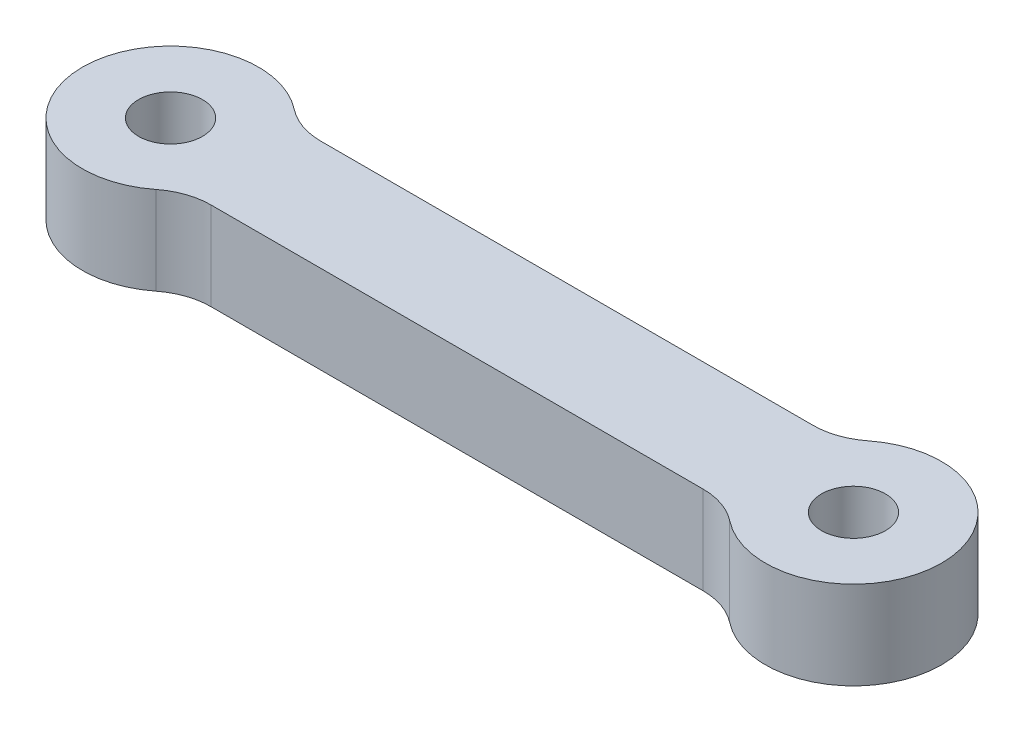
ISO-10303-21;
HEADER;
FILE_DESCRIPTION(('STEP AP214'),'2;1');
FILE_NAME('part.step','',(''),(''),'','','');
FILE_SCHEMA(('AUTOMOTIVE_DESIGN { 1 0 10303 214 1 1 1 1 }'));
ENDSEC;
DATA;
#1=APPLICATION_CONTEXT('core data for automotive mechanical design processes');
#2=APPLICATION_PROTOCOL_DEFINITION('international standard','automotive_design',2000,#1);
#3=PRODUCT_CONTEXT('',#1,'mechanical');
#4=PRODUCT('Part','Part','',(#3));
#5=PRODUCT_RELATED_PRODUCT_CATEGORY('part','',(#4));
#6=PRODUCT_DEFINITION_FORMATION('','',#4);
#7=PRODUCT_DEFINITION_CONTEXT('part definition',#1,'design');
#8=PRODUCT_DEFINITION('design','',#6,#7);
#9=PRODUCT_DEFINITION_SHAPE('','',#8);
#10=(LENGTH_UNIT() NAMED_UNIT(*) SI_UNIT(.MILLI.,.METRE.));
#11=(NAMED_UNIT(*) PLANE_ANGLE_UNIT() SI_UNIT($,.RADIAN.));
#12=(NAMED_UNIT(*) SI_UNIT($,.STERADIAN.) SOLID_ANGLE_UNIT());
#13=UNCERTAINTY_MEASURE_WITH_UNIT(LENGTH_MEASURE(1.E-05),#10,'distance_accuracy_value','');
#14=(GEOMETRIC_REPRESENTATION_CONTEXT(3) GLOBAL_UNCERTAINTY_ASSIGNED_CONTEXT((#13)) GLOBAL_UNIT_ASSIGNED_CONTEXT((#10,
#11,#12)) REPRESENTATION_CONTEXT('',''));
#15=CARTESIAN_POINT('',(0.,0.,0.));
#16=DIRECTION('',(0.,0.,1.));
#17=DIRECTION('',(1.,0.,0.));
#18=AXIS2_PLACEMENT_3D('',#15,#16,#17);
#19=CARTESIAN_POINT('',(31.,4.,0.));
#20=DIRECTION('',(0.,-1.,0.));
#21=DIRECTION('',(0.,0.,-1.));
#22=AXIS2_PLACEMENT_3D('',#19,#20,#21);
#23=CYLINDRICAL_SURFACE('',#22,4.00000000000001);
#24=CARTESIAN_POINT('',(31.,4.,0.));
#25=DIRECTION('',(0.,1.,0.));
#26=DIRECTION('',(0.,0.,1.));
#27=AXIS2_PLACEMENT_3D('',#24,#25,#26);
#28=CIRCLE('',#27,4.00000000000001);
#29=CARTESIAN_POINT('',(28.525641703473,4.,3.14285714285714));
#30=VERTEX_POINT('',#29);
#31=CARTESIAN_POINT('',(28.525641703473,4.,-3.14285714285714));
#32=VERTEX_POINT('',#31);
#33=EDGE_CURVE('E159',#30,#32,#28,.T.);
#34=ORIENTED_EDGE('',*,*,#33,.F.);
#35=DIRECTION('',(0.,-1.,0.));
#36=VECTOR('',#35,1.);
#37=CARTESIAN_POINT('',(28.525641703473,4.,3.14285714285714));
#38=LINE('',#37,#36);
#39=CARTESIAN_POINT('',(28.525641703473,0.,3.14285714285714));
#40=VERTEX_POINT('',#39);
#41=EDGE_CURVE('E171',#30,#40,#38,.T.);
#42=ORIENTED_EDGE('',*,*,#41,.T.);
#43=CARTESIAN_POINT('',(31.,0.,0.));
#44=DIRECTION('',(0.,1.,0.));
#45=DIRECTION('',(0.,0.,1.));
#46=AXIS2_PLACEMENT_3D('',#43,#44,#45);
#47=CIRCLE('',#46,4.00000000000001);
#48=CARTESIAN_POINT('',(28.525641703473,0.,-3.14285714285714));
#49=VERTEX_POINT('',#48);
#50=EDGE_CURVE('E198',#40,#49,#47,.T.);
#51=ORIENTED_EDGE('',*,*,#50,.T.);
#52=DIRECTION('',(0.,-1.,0.));
#53=VECTOR('',#52,1.);
#54=CARTESIAN_POINT('',(28.525641703473,4.,-3.14285714285714));
#55=LINE('',#54,#53);
#56=EDGE_CURVE('E168',#49,#32,#55,.F.);
#57=ORIENTED_EDGE('',*,*,#56,.T.);
#58=EDGE_LOOP('',(#34,#42,#51,#57));
#59=FACE_BOUND('',#58,.T.);
#60=ADVANCED_FACE('F46',(#59),#23,.T.);
#61=CARTESIAN_POINT('',(0.,4.,-2.5));
#62=DIRECTION('',(0.,0.,-1.));
#63=DIRECTION('',(-1.,0.,0.));
#64=AXIS2_PLACEMENT_3D('',#61,#62,#63);
#65=PLANE('',#64);
#66=DIRECTION('',(1.,0.,0.));
#67=VECTOR('',#66,1.);
#68=CARTESIAN_POINT('',(0.,4.,-2.5));
#69=LINE('',#68,#67);
#70=CARTESIAN_POINT('',(4.33012701892219,4.,-2.5));
#71=VERTEX_POINT('',#70);
#72=CARTESIAN_POINT('',(26.6698729810778,4.,-2.5));
#73=VERTEX_POINT('',#72);
#74=EDGE_CURVE('E205',#71,#73,#69,.T.);
#75=ORIENTED_EDGE('',*,*,#74,.T.);
#76=DIRECTION('',(0.,-1.,0.));
#77=VECTOR('',#76,1.);
#78=CARTESIAN_POINT('',(26.6698729810778,4.,-2.5));
#79=LINE('',#78,#77);
#80=CARTESIAN_POINT('',(26.6698729810778,0.,-2.5));
#81=VERTEX_POINT('',#80);
#82=EDGE_CURVE('E125',#73,#81,#79,.T.);
#83=ORIENTED_EDGE('',*,*,#82,.T.);
#84=DIRECTION('',(1.,0.,0.));
#85=VECTOR('',#84,1.);
#86=CARTESIAN_POINT('',(0.,0.,-2.5));
#87=LINE('',#86,#85);
#88=CARTESIAN_POINT('',(4.33012701892219,0.,-2.5));
#89=VERTEX_POINT('',#88);
#90=EDGE_CURVE('E152',#89,#81,#87,.T.);
#91=ORIENTED_EDGE('',*,*,#90,.F.);
#92=DIRECTION('',(0.,-1.,0.));
#93=VECTOR('',#92,1.);
#94=CARTESIAN_POINT('',(4.33012701892219,4.,-2.5));
#95=LINE('',#94,#93);
#96=EDGE_CURVE('E69',#89,#71,#95,.F.);
#97=ORIENTED_EDGE('',*,*,#96,.T.);
#98=EDGE_LOOP('',(#75,#83,#91,#97));
#99=FACE_BOUND('',#98,.T.);
#100=ADVANCED_FACE('F195',(#99),#65,.T.);
#101=CARTESIAN_POINT('',(0.,4.,0.));
#102=DIRECTION('',(0.,-1.,0.));
#103=DIRECTION('',(0.,0.,-1.));
#104=AXIS2_PLACEMENT_3D('',#101,#102,#103);
#105=CYLINDRICAL_SURFACE('',#104,4.);
#106=CARTESIAN_POINT('',(0.,0.,0.));
#107=DIRECTION('',(0.,1.,0.));
#108=DIRECTION('',(0.,0.,1.));
#109=AXIS2_PLACEMENT_3D('',#106,#107,#108);
#110=CIRCLE('',#109,4.);
#111=CARTESIAN_POINT('',(2.47435829652697,0.,-3.14285714285714));
#112=VERTEX_POINT('',#111);
#113=CARTESIAN_POINT('',(2.47435829652697,0.,3.14285714285714));
#114=VERTEX_POINT('',#113);
#115=EDGE_CURVE('E145',#112,#114,#110,.T.);
#116=ORIENTED_EDGE('',*,*,#115,.T.);
#117=DIRECTION('',(0.,-1.,0.));
#118=VECTOR('',#117,1.);
#119=CARTESIAN_POINT('',(2.47435829652697,4.,3.14285714285714));
#120=LINE('',#119,#118);
#121=CARTESIAN_POINT('',(2.47435829652697,4.,3.14285714285714));
#122=VERTEX_POINT('',#121);
#123=EDGE_CURVE('E118',#114,#122,#120,.F.);
#124=ORIENTED_EDGE('',*,*,#123,.T.);
#125=CARTESIAN_POINT('',(0.,4.,0.));
#126=DIRECTION('',(0.,1.,0.));
#127=DIRECTION('',(0.,0.,1.));
#128=AXIS2_PLACEMENT_3D('',#125,#126,#127);
#129=CIRCLE('',#128,4.);
#130=CARTESIAN_POINT('',(2.47435829652697,4.,-3.14285714285714));
#131=VERTEX_POINT('',#130);
#132=EDGE_CURVE('E204',#131,#122,#129,.T.);
#133=ORIENTED_EDGE('',*,*,#132,.F.);
#134=DIRECTION('',(0.,-1.,0.));
#135=VECTOR('',#134,1.);
#136=CARTESIAN_POINT('',(2.47435829652697,4.,-3.14285714285714));
#137=LINE('',#136,#135);
#138=EDGE_CURVE('E136',#131,#112,#137,.T.);
#139=ORIENTED_EDGE('',*,*,#138,.T.);
#140=EDGE_LOOP('',(#116,#124,#133,#139));
#141=FACE_BOUND('',#140,.T.);
#142=ADVANCED_FACE('F207',(#141),#105,.T.);
#143=CARTESIAN_POINT('',(0.,4.,0.));
#144=DIRECTION('',(0.,-1.,0.));
#145=DIRECTION('',(0.,0.,-1.));
#146=AXIS2_PLACEMENT_3D('',#143,#144,#145);
#147=CYLINDRICAL_SURFACE('',#146,1.45);
#148=CARTESIAN_POINT('',(0.,4.,0.));
#149=DIRECTION('',(0.,1.,0.));
#150=DIRECTION('',(0.,0.,1.));
#151=AXIS2_PLACEMENT_3D('',#148,#149,#150);
#152=CIRCLE('',#151,1.45);
#153=CARTESIAN_POINT('',(0.,4.,1.45));
#154=VERTEX_POINT('',#153);
#155=EDGE_CURVE('E212',#154,#154,#152,.T.);
#156=ORIENTED_EDGE('',*,*,#155,.T.);
#157=EDGE_LOOP('',(#156));
#158=FACE_BOUND('',#157,.T.);
#159=CARTESIAN_POINT('',(0.,0.,0.));
#160=DIRECTION('',(0.,1.,0.));
#161=DIRECTION('',(0.,0.,1.));
#162=AXIS2_PLACEMENT_3D('',#159,#160,#161);
#163=CIRCLE('',#162,1.45);
#164=CARTESIAN_POINT('',(0.,0.,1.45));
#165=VERTEX_POINT('',#164);
#166=EDGE_CURVE('E144',#165,#165,#163,.T.);
#167=ORIENTED_EDGE('',*,*,#166,.F.);
#168=EDGE_LOOP('',(#167));
#169=FACE_BOUND('',#168,.T.);
#170=ADVANCED_FACE('F261',(#158,#169),#147,.F.);
#171=CARTESIAN_POINT('',(0.,4.,2.5));
#172=DIRECTION('',(0.,0.,-1.));
#173=DIRECTION('',(-1.,0.,0.));
#174=AXIS2_PLACEMENT_3D('',#171,#172,#173);
#175=PLANE('',#174);
#176=DIRECTION('',(1.,0.,0.));
#177=VECTOR('',#176,1.);
#178=CARTESIAN_POINT('',(0.,4.,2.5));
#179=LINE('',#178,#177);
#180=CARTESIAN_POINT('',(4.3301270189222,4.,2.5));
#181=VERTEX_POINT('',#180);
#182=CARTESIAN_POINT('',(26.6698729810778,4.,2.5));
#183=VERTEX_POINT('',#182);
#184=EDGE_CURVE('E134',#181,#183,#179,.T.);
#185=ORIENTED_EDGE('',*,*,#184,.F.);
#186=DIRECTION('',(0.,1.,0.));
#187=VECTOR('',#186,1.);
#188=CARTESIAN_POINT('',(4.3301270189222,0.,2.5));
#189=LINE('',#188,#187);
#190=CARTESIAN_POINT('',(4.3301270189222,0.,2.5));
#191=VERTEX_POINT('',#190);
#192=EDGE_CURVE('E117',#181,#191,#189,.F.);
#193=ORIENTED_EDGE('',*,*,#192,.T.);
#194=DIRECTION('',(1.,0.,0.));
#195=VECTOR('',#194,1.);
#196=CARTESIAN_POINT('',(0.,0.,2.5));
#197=LINE('',#196,#195);
#198=CARTESIAN_POINT('',(26.6698729810778,0.,2.5));
#199=VERTEX_POINT('',#198);
#200=EDGE_CURVE('E131',#191,#199,#197,.T.);
#201=ORIENTED_EDGE('',*,*,#200,.T.);
#202=DIRECTION('',(0.,1.,0.));
#203=VECTOR('',#202,1.);
#204=CARTESIAN_POINT('',(26.6698729810778,4.,2.5));
#205=LINE('',#204,#203);
#206=EDGE_CURVE('E137',#199,#183,#205,.T.);
#207=ORIENTED_EDGE('',*,*,#206,.T.);
#208=EDGE_LOOP('',(#185,#193,#201,#207));
#209=FACE_BOUND('',#208,.T.);
#210=ADVANCED_FACE('F130',(#209),#175,.F.);
#211=CARTESIAN_POINT('',(31.,4.,0.));
#212=DIRECTION('',(0.,-1.,0.));
#213=DIRECTION('',(0.,0.,-1.));
#214=AXIS2_PLACEMENT_3D('',#211,#212,#213);
#215=CYLINDRICAL_SURFACE('',#214,1.45);
#216=CARTESIAN_POINT('',(31.,4.,0.));
#217=DIRECTION('',(0.,1.,0.));
#218=DIRECTION('',(0.,0.,1.));
#219=AXIS2_PLACEMENT_3D('',#216,#217,#218);
#220=CIRCLE('',#219,1.45);
#221=CARTESIAN_POINT('',(31.,4.,1.45));
#222=VERTEX_POINT('',#221);
#223=EDGE_CURVE('E161',#222,#222,#220,.T.);
#224=ORIENTED_EDGE('',*,*,#223,.T.);
#225=EDGE_LOOP('',(#224));
#226=FACE_BOUND('',#225,.T.);
#227=CARTESIAN_POINT('',(31.,0.,0.));
#228=DIRECTION('',(0.,1.,0.));
#229=DIRECTION('',(0.,0.,1.));
#230=AXIS2_PLACEMENT_3D('',#227,#228,#229);
#231=CIRCLE('',#230,1.45);
#232=CARTESIAN_POINT('',(31.,0.,1.45));
#233=VERTEX_POINT('',#232);
#234=EDGE_CURVE('E150',#233,#233,#231,.T.);
#235=ORIENTED_EDGE('',*,*,#234,.F.);
#236=EDGE_LOOP('',(#235));
#237=FACE_BOUND('',#236,.T.);
#238=ADVANCED_FACE('F255',(#226,#237),#215,.F.);
#239=CARTESIAN_POINT('',(0.,4.,0.));
#240=DIRECTION('',(0.,1.,0.));
#241=DIRECTION('',(0.,0.,1.));
#242=AXIS2_PLACEMENT_3D('',#239,#240,#241);
#243=PLANE('',#242);
#244=ORIENTED_EDGE('',*,*,#184,.T.);
#245=CARTESIAN_POINT('',(26.6698729810778,4.,5.5));
#246=DIRECTION('',(0.,1.,0.));
#247=DIRECTION('',(0.,0.,1.));
#248=AXIS2_PLACEMENT_3D('',#245,#246,#247);
#249=CIRCLE('',#248,3.);
#250=EDGE_CURVE('E184',#183,#30,#249,.F.);
#251=ORIENTED_EDGE('',*,*,#250,.T.);
#252=ORIENTED_EDGE('',*,*,#33,.T.);
#253=CARTESIAN_POINT('',(26.6698729810778,4.,-5.5));
#254=DIRECTION('',(0.,1.,0.));
#255=DIRECTION('',(0.,0.,1.));
#256=AXIS2_PLACEMENT_3D('',#253,#254,#255);
#257=CIRCLE('',#256,3.);
#258=EDGE_CURVE('E62',#32,#73,#257,.F.);
#259=ORIENTED_EDGE('',*,*,#258,.T.);
#260=ORIENTED_EDGE('',*,*,#74,.F.);
#261=CARTESIAN_POINT('',(4.33012701892219,4.,-5.5));
#262=DIRECTION('',(0.,1.,0.));
#263=DIRECTION('',(0.,0.,1.));
#264=AXIS2_PLACEMENT_3D('',#261,#262,#263);
#265=CIRCLE('',#264,3.);
#266=EDGE_CURVE('E11',#71,#131,#265,.F.);
#267=ORIENTED_EDGE('',*,*,#266,.T.);
#268=ORIENTED_EDGE('',*,*,#132,.T.);
#269=CARTESIAN_POINT('',(4.3301270189222,4.,5.5));
#270=DIRECTION('',(0.,1.,0.));
#271=DIRECTION('',(0.,0.,1.));
#272=AXIS2_PLACEMENT_3D('',#269,#270,#271);
#273=CIRCLE('',#272,3.);
#274=EDGE_CURVE('E124',#122,#181,#273,.F.);
#275=ORIENTED_EDGE('',*,*,#274,.T.);
#276=EDGE_LOOP('',(#244,#251,#252,#259,#260,#267,#268,#275));
#277=FACE_BOUND('',#276,.T.);
#278=ORIENTED_EDGE('',*,*,#155,.F.);
#279=EDGE_LOOP('',(#278));
#280=FACE_BOUND('',#279,.T.);
#281=ORIENTED_EDGE('',*,*,#223,.F.);
#282=EDGE_LOOP('',(#281));
#283=FACE_BOUND('',#282,.T.);
#284=ADVANCED_FACE('F202',(#277,#280,#283),#243,.T.);
#285=CARTESIAN_POINT('',(0.,0.,0.));
#286=DIRECTION('',(0.,1.,0.));
#287=DIRECTION('',(0.,0.,1.));
#288=AXIS2_PLACEMENT_3D('',#285,#286,#287);
#289=PLANE('',#288);
#290=ORIENTED_EDGE('',*,*,#50,.F.);
#291=CARTESIAN_POINT('',(26.6698729810778,0.,5.5));
#292=DIRECTION('',(0.,1.,0.));
#293=DIRECTION('',(0.,0.,1.));
#294=AXIS2_PLACEMENT_3D('',#291,#292,#293);
#295=CIRCLE('',#294,3.);
#296=EDGE_CURVE('E142',#40,#199,#295,.T.);
#297=ORIENTED_EDGE('',*,*,#296,.T.);
#298=ORIENTED_EDGE('',*,*,#200,.F.);
#299=CARTESIAN_POINT('',(4.3301270189222,0.,5.5));
#300=DIRECTION('',(0.,1.,0.));
#301=DIRECTION('',(0.,0.,1.));
#302=AXIS2_PLACEMENT_3D('',#299,#300,#301);
#303=CIRCLE('',#302,3.);
#304=EDGE_CURVE('E113',#191,#114,#303,.T.);
#305=ORIENTED_EDGE('',*,*,#304,.T.);
#306=ORIENTED_EDGE('',*,*,#115,.F.);
#307=CARTESIAN_POINT('',(4.33012701892219,0.,-5.5));
#308=DIRECTION('',(0.,1.,0.));
#309=DIRECTION('',(0.,0.,1.));
#310=AXIS2_PLACEMENT_3D('',#307,#308,#309);
#311=CIRCLE('',#310,3.);
#312=EDGE_CURVE('E55',#112,#89,#311,.T.);
#313=ORIENTED_EDGE('',*,*,#312,.T.);
#314=ORIENTED_EDGE('',*,*,#90,.T.);
#315=CARTESIAN_POINT('',(26.6698729810778,0.,-5.5));
#316=DIRECTION('',(0.,1.,0.));
#317=DIRECTION('',(0.,0.,1.));
#318=AXIS2_PLACEMENT_3D('',#315,#316,#317);
#319=CIRCLE('',#318,3.);
#320=EDGE_CURVE('E187',#81,#49,#319,.T.);
#321=ORIENTED_EDGE('',*,*,#320,.T.);
#322=EDGE_LOOP('',(#290,#297,#298,#305,#306,#313,#314,#321));
#323=FACE_BOUND('',#322,.T.);
#324=ORIENTED_EDGE('',*,*,#166,.T.);
#325=EDGE_LOOP('',(#324));
#326=FACE_BOUND('',#325,.T.);
#327=ORIENTED_EDGE('',*,*,#234,.T.);
#328=EDGE_LOOP('',(#327));
#329=FACE_BOUND('',#328,.T.);
#330=ADVANCED_FACE('F140',(#323,#326,#329),#289,.F.);
#331=CARTESIAN_POINT('',(4.3301270189222,4.,5.5));
#332=DIRECTION('',(0.,-1.,0.));
#333=DIRECTION('',(0.,0.,-1.));
#334=AXIS2_PLACEMENT_3D('',#331,#332,#333);
#335=CYLINDRICAL_SURFACE('',#334,3.);
#336=ORIENTED_EDGE('',*,*,#274,.F.);
#337=ORIENTED_EDGE('',*,*,#123,.F.);
#338=ORIENTED_EDGE('',*,*,#304,.F.);
#339=ORIENTED_EDGE('',*,*,#192,.F.);
#340=EDGE_LOOP('',(#336,#337,#338,#339));
#341=FACE_BOUND('',#340,.T.);
#342=ADVANCED_FACE('F116',(#341),#335,.F.);
#343=CARTESIAN_POINT('',(26.6698729810778,4.,5.5));
#344=DIRECTION('',(0.,-1.,0.));
#345=DIRECTION('',(0.,0.,-1.));
#346=AXIS2_PLACEMENT_3D('',#343,#344,#345);
#347=CYLINDRICAL_SURFACE('',#346,3.);
#348=ORIENTED_EDGE('',*,*,#250,.F.);
#349=ORIENTED_EDGE('',*,*,#206,.F.);
#350=ORIENTED_EDGE('',*,*,#296,.F.);
#351=ORIENTED_EDGE('',*,*,#41,.F.);
#352=EDGE_LOOP('',(#348,#349,#350,#351));
#353=FACE_BOUND('',#352,.T.);
#354=ADVANCED_FACE('F232',(#353),#347,.F.);
#355=CARTESIAN_POINT('',(26.6698729810778,4.,-5.5));
#356=DIRECTION('',(0.,-1.,0.));
#357=DIRECTION('',(0.,0.,-1.));
#358=AXIS2_PLACEMENT_3D('',#355,#356,#357);
#359=CYLINDRICAL_SURFACE('',#358,3.);
#360=ORIENTED_EDGE('',*,*,#258,.F.);
#361=ORIENTED_EDGE('',*,*,#56,.F.);
#362=ORIENTED_EDGE('',*,*,#320,.F.);
#363=ORIENTED_EDGE('',*,*,#82,.F.);
#364=EDGE_LOOP('',(#360,#361,#362,#363));
#365=FACE_BOUND('',#364,.T.);
#366=ADVANCED_FACE('F230',(#365),#359,.F.);
#367=CARTESIAN_POINT('',(4.33012701892219,4.,-5.5));
#368=DIRECTION('',(0.,-1.,0.));
#369=DIRECTION('',(0.,0.,-1.));
#370=AXIS2_PLACEMENT_3D('',#367,#368,#369);
#371=CYLINDRICAL_SURFACE('',#370,3.);
#372=ORIENTED_EDGE('',*,*,#266,.F.);
#373=ORIENTED_EDGE('',*,*,#96,.F.);
#374=ORIENTED_EDGE('',*,*,#312,.F.);
#375=ORIENTED_EDGE('',*,*,#138,.F.);
#376=EDGE_LOOP('',(#372,#373,#374,#375));
#377=FACE_BOUND('',#376,.T.);
#378=ADVANCED_FACE('F48',(#377),#371,.F.);
#379=CLOSED_SHELL('',(#60,#100,#142,#170,#210,#238,#284,#330,#342,#354,#366,#378));
#380=MANIFOLD_SOLID_BREP('B2',#379);
#381=ADVANCED_BREP_SHAPE_REPRESENTATION('',(#18,#380),#14);
#382=SHAPE_DEFINITION_REPRESENTATION(#9,#381);
ENDSEC;
END-ISO-10303-21;
